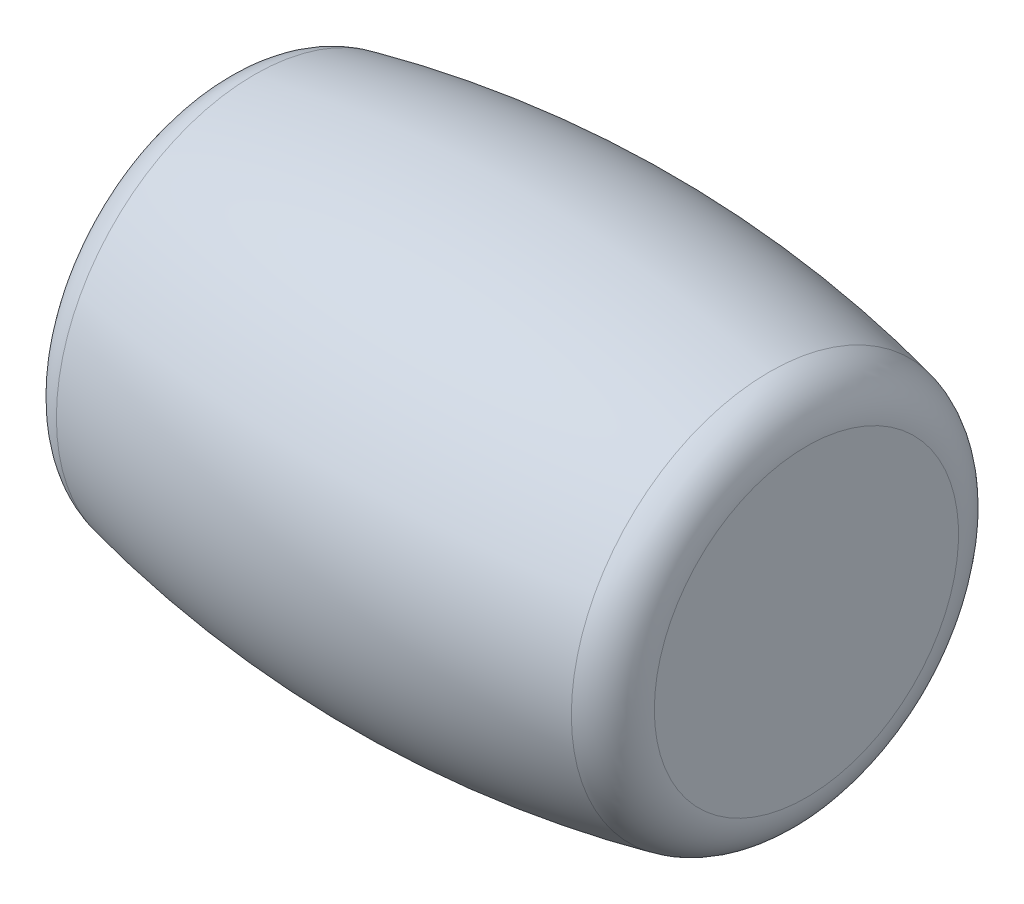
ISO-10303-21;
HEADER;
FILE_DESCRIPTION(('STEP AP214'),'2;1');
FILE_NAME('part.step','',(''),(''),'','','');
FILE_SCHEMA(('AUTOMOTIVE_DESIGN { 1 0 10303 214 1 1 1 1 }'));
ENDSEC;
DATA;
#1=APPLICATION_CONTEXT('core data for automotive mechanical design processes');
#2=APPLICATION_PROTOCOL_DEFINITION('international standard','automotive_design',2000,#1);
#3=PRODUCT_CONTEXT('',#1,'mechanical');
#4=PRODUCT('Part','Part','',(#3));
#5=PRODUCT_RELATED_PRODUCT_CATEGORY('part','',(#4));
#6=PRODUCT_DEFINITION_FORMATION('','',#4);
#7=PRODUCT_DEFINITION_CONTEXT('part definition',#1,'design');
#8=PRODUCT_DEFINITION('design','',#6,#7);
#9=PRODUCT_DEFINITION_SHAPE('','',#8);
#10=(LENGTH_UNIT() NAMED_UNIT(*) SI_UNIT(.MILLI.,.METRE.));
#11=(NAMED_UNIT(*) PLANE_ANGLE_UNIT() SI_UNIT($,.RADIAN.));
#12=(NAMED_UNIT(*) SI_UNIT($,.STERADIAN.) SOLID_ANGLE_UNIT());
#13=UNCERTAINTY_MEASURE_WITH_UNIT(LENGTH_MEASURE(1.E-05),#10,'distance_accuracy_value','');
#14=(GEOMETRIC_REPRESENTATION_CONTEXT(3) GLOBAL_UNCERTAINTY_ASSIGNED_CONTEXT((#13)) GLOBAL_UNIT_ASSIGNED_CONTEXT((#10,
#11,#12)) REPRESENTATION_CONTEXT('',''));
#15=CARTESIAN_POINT('',(0.,0.,0.));
#16=DIRECTION('',(0.,0.,1.));
#17=DIRECTION('',(1.,0.,0.));
#18=AXIS2_PLACEMENT_3D('',#15,#16,#17);
#19=CARTESIAN_POINT('',(-5.25,20.6,0.));
#20=DIRECTION('',(-1.,0.,0.));
#21=DIRECTION('',(0.,0.,1.));
#22=AXIS2_PLACEMENT_3D('',#19,#20,#21);
#23=TOROIDAL_SURFACE('',#22,3.22850184128243,0.999999999999999);
#24=CARTESIAN_POINT('',(-6.25,20.6,0.));
#25=DIRECTION('',(-1.,0.,0.));
#26=DIRECTION('',(0.,0.,1.));
#27=AXIS2_PLACEMENT_3D('',#24,#25,#26);
#28=CIRCLE('',#27,3.22850184128243);
#29=CARTESIAN_POINT('',(-6.25,20.6,3.22850184128243));
#30=VERTEX_POINT('',#29);
#31=EDGE_CURVE('E10',#30,#30,#28,.T.);
#32=ORIENTED_EDGE('',*,*,#31,.F.);
#33=EDGE_LOOP('',(#32));
#34=FACE_BOUND('',#33,.T.);
#35=CARTESIAN_POINT('',(-5.46516393442623,20.6,0.));
#36=DIRECTION('',(-1.,0.,0.));
#37=DIRECTION('',(0.,0.,1.));
#38=AXIS2_PLACEMENT_3D('',#35,#36,#37);
#39=CIRCLE('',#38,4.20507978559728);
#40=CARTESIAN_POINT('',(-5.46516393442623,20.6,4.20507978559728));
#41=VERTEX_POINT('',#40);
#42=EDGE_CURVE('E42',#41,#41,#39,.T.);
#43=ORIENTED_EDGE('',*,*,#42,.T.);
#44=EDGE_LOOP('',(#43));
#45=FACE_BOUND('',#44,.T.);
#46=ADVANCED_FACE('F28',(#34,#45),#23,.T.);
#47=CARTESIAN_POINT('',(-6.25,23.8285018412824,0.));
#48=DIRECTION('',(1.,0.,0.));
#49=DIRECTION('',(0.,0.,-1.));
#50=AXIS2_PLACEMENT_3D('',#47,#48,#49);
#51=PLANE('',#50);
#52=ORIENTED_EDGE('',*,*,#31,.T.);
#53=EDGE_LOOP('',(#52));
#54=FACE_BOUND('',#53,.T.);
#55=ADVANCED_FACE('F62',(#54),#51,.F.);
#56=CARTESIAN_POINT('',(6.25,23.8285018412824,0.));
#57=DIRECTION('',(-1.,0.,0.));
#58=DIRECTION('',(0.,0.,1.));
#59=AXIS2_PLACEMENT_3D('',#56,#57,#58);
#60=PLANE('',#59);
#61=CARTESIAN_POINT('',(6.25,20.6,0.));
#62=DIRECTION('',(-1.,0.,0.));
#63=DIRECTION('',(0.,0.,1.));
#64=AXIS2_PLACEMENT_3D('',#61,#62,#63);
#65=CIRCLE('',#64,3.22850184128243);
#66=CARTESIAN_POINT('',(6.25,20.6,3.22850184128243));
#67=VERTEX_POINT('',#66);
#68=EDGE_CURVE('E34',#67,#67,#65,.T.);
#69=ORIENTED_EDGE('',*,*,#68,.F.);
#70=EDGE_LOOP('',(#69));
#71=FACE_BOUND('',#70,.T.);
#72=ADVANCED_FACE('F57',(#71),#60,.F.);
#73=CARTESIAN_POINT('',(5.25,20.6,0.));
#74=DIRECTION('',(-1.,0.,0.));
#75=DIRECTION('',(0.,0.,1.));
#76=AXIS2_PLACEMENT_3D('',#73,#74,#75);
#77=TOROIDAL_SURFACE('',#76,3.22850184128243,1.);
#78=CARTESIAN_POINT('',(5.46516393442623,20.6,0.));
#79=DIRECTION('',(-1.,0.,0.));
#80=DIRECTION('',(0.,0.,1.));
#81=AXIS2_PLACEMENT_3D('',#78,#79,#80);
#82=CIRCLE('',#81,4.20507978559728);
#83=CARTESIAN_POINT('',(5.46516393442623,20.6,4.20507978559728));
#84=VERTEX_POINT('',#83);
#85=EDGE_CURVE('E38',#84,#84,#82,.T.);
#86=ORIENTED_EDGE('',*,*,#85,.F.);
#87=EDGE_LOOP('',(#86));
#88=FACE_BOUND('',#87,.T.);
#89=ORIENTED_EDGE('',*,*,#68,.T.);
#90=EDGE_LOOP('',(#89));
#91=FACE_BOUND('',#90,.T.);
#92=ADVANCED_FACE('F52',(#88,#91),#77,.T.);
#93=CARTESIAN_POINT('',(0.,20.6,0.));
#94=DIRECTION('',(-1.,0.,0.));
#95=DIRECTION('',(0.,0.,1.));
#96=AXIS2_PLACEMENT_3D('',#93,#94,#95);
#97=DEGENERATE_TOROIDAL_SURFACE('',#96,20.6,25.4,.F.);
#98=ORIENTED_EDGE('',*,*,#42,.F.);
#99=EDGE_LOOP('',(#98));
#100=FACE_BOUND('',#99,.T.);
#101=ORIENTED_EDGE('',*,*,#85,.T.);
#102=EDGE_LOOP('',(#101));
#103=FACE_BOUND('',#102,.T.);
#104=ADVANCED_FACE('F49',(#100,#103),#97,.F.);
#105=CLOSED_SHELL('',(#46,#55,#72,#92,#104));
#106=MANIFOLD_SOLID_BREP('B2',#105);
#107=ADVANCED_BREP_SHAPE_REPRESENTATION('',(#18,#106),#14);
#108=SHAPE_DEFINITION_REPRESENTATION(#9,#107);
ENDSEC;
END-ISO-10303-21;
